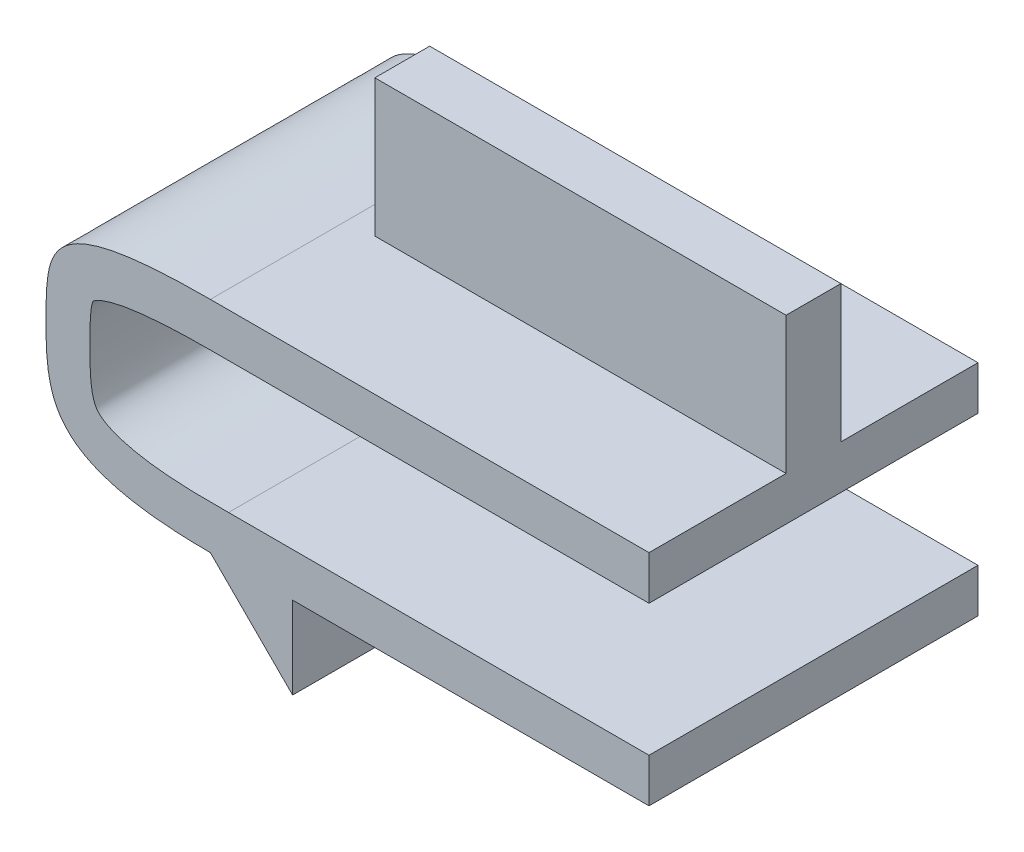
ISO-10303-21;
HEADER;
FILE_DESCRIPTION(('STEP AP214'),'2;1');
FILE_NAME('part.step','',(''),(''),'','','');
FILE_SCHEMA(('AUTOMOTIVE_DESIGN { 1 0 10303 214 1 1 1 1 }'));
ENDSEC;
DATA;
#1=APPLICATION_CONTEXT('core data for automotive mechanical design processes');
#2=APPLICATION_PROTOCOL_DEFINITION('international standard','automotive_design',2000,#1);
#3=PRODUCT_CONTEXT('',#1,'mechanical');
#4=PRODUCT('Part','Part','',(#3));
#5=PRODUCT_RELATED_PRODUCT_CATEGORY('part','',(#4));
#6=PRODUCT_DEFINITION_FORMATION('','',#4);
#7=PRODUCT_DEFINITION_CONTEXT('part definition',#1,'design');
#8=PRODUCT_DEFINITION('design','',#6,#7);
#9=PRODUCT_DEFINITION_SHAPE('','',#8);
#10=(LENGTH_UNIT() NAMED_UNIT(*) SI_UNIT(.MILLI.,.METRE.));
#11=(NAMED_UNIT(*) PLANE_ANGLE_UNIT() SI_UNIT($,.RADIAN.));
#12=(NAMED_UNIT(*) SI_UNIT($,.STERADIAN.) SOLID_ANGLE_UNIT());
#13=UNCERTAINTY_MEASURE_WITH_UNIT(LENGTH_MEASURE(1.E-05),#10,'distance_accuracy_value','');
#14=(GEOMETRIC_REPRESENTATION_CONTEXT(3) GLOBAL_UNCERTAINTY_ASSIGNED_CONTEXT((#13)) GLOBAL_UNIT_ASSIGNED_CONTEXT((#10,
#11,#12)) REPRESENTATION_CONTEXT('',''));
#15=CARTESIAN_POINT('',(0.,0.,0.));
#16=DIRECTION('',(0.,0.,1.));
#17=DIRECTION('',(1.,0.,0.));
#18=AXIS2_PLACEMENT_3D('',#15,#16,#17);
#19=CARTESIAN_POINT('',(22.,49.150430771125,49.2715397146817));
#20=DIRECTION('',(0.,1.,0.));
#21=DIRECTION('',(0.,0.,1.));
#22=AXIS2_PLACEMENT_3D('',#19,#20,#21);
#23=PLANE('',#22);
#24=DIRECTION('',(0.,0.,1.));
#25=VECTOR('',#24,1.);
#26=CARTESIAN_POINT('',(22.,49.150430771125,49.2715397146817));
#27=LINE('',#26,#25);
#28=CARTESIAN_POINT('',(22.,49.150430771125,56.2715397146817));
#29=VERTEX_POINT('',#28);
#30=CARTESIAN_POINT('',(22.,49.150430771125,61.2715397146816));
#31=VERTEX_POINT('',#30);
#32=EDGE_CURVE('E151',#29,#31,#27,.T.);
#33=ORIENTED_EDGE('',*,*,#32,.F.);
#34=DIRECTION('',(1.,0.,0.));
#35=VECTOR('',#34,1.);
#36=CARTESIAN_POINT('',(22.,49.150430771125,56.2715397146817));
#37=LINE('',#36,#35);
#38=CARTESIAN_POINT('',(7.,49.150430771125,56.2715397146817));
#39=VERTEX_POINT('',#38);
#40=EDGE_CURVE('E421',#39,#29,#37,.T.);
#41=ORIENTED_EDGE('',*,*,#40,.F.);
#42=DIRECTION('',(0.,0.,1.));
#43=VECTOR('',#42,1.);
#44=CARTESIAN_POINT('',(7.,49.150430771125,54.2715397146816));
#45=LINE('',#44,#43);
#46=CARTESIAN_POINT('',(7.,49.150430771125,54.2715397146816));
#47=VERTEX_POINT('',#46);
#48=EDGE_CURVE('E419',#47,#39,#45,.T.);
#49=ORIENTED_EDGE('',*,*,#48,.F.);
#50=DIRECTION('',(-1.,0.,0.));
#51=VECTOR('',#50,1.);
#52=CARTESIAN_POINT('',(22.,49.150430771125,54.2715397146816));
#53=LINE('',#52,#51);
#54=CARTESIAN_POINT('',(22.,49.150430771125,54.2715397146816));
#55=VERTEX_POINT('',#54);
#56=EDGE_CURVE('E414',#55,#47,#53,.T.);
#57=ORIENTED_EDGE('',*,*,#56,.F.);
#58=CARTESIAN_POINT('',(22.,49.150430771125,49.2715397146817));
#59=VERTEX_POINT('',#58);
#60=EDGE_CURVE('E37',#59,#55,#27,.T.);
#61=ORIENTED_EDGE('',*,*,#60,.F.);
#62=DIRECTION('',(-1.,0.,0.));
#63=VECTOR('',#62,1.);
#64=CARTESIAN_POINT('',(22.,49.150430771125,49.2715397146817));
#65=LINE('',#64,#63);
#66=CARTESIAN_POINT('',(6.,49.150430771125,49.2715397146817));
#67=VERTEX_POINT('',#66);
#68=EDGE_CURVE('E197',#59,#67,#65,.T.);
#69=ORIENTED_EDGE('',*,*,#68,.T.);
#70=DIRECTION('',(0.,0.,1.));
#71=VECTOR('',#70,1.);
#72=CARTESIAN_POINT('',(6.,49.150430771125,49.2715397146817));
#73=LINE('',#72,#71);
#74=CARTESIAN_POINT('',(6.,49.150430771125,61.2715397146816));
#75=VERTEX_POINT('',#74);
#76=EDGE_CURVE('E227',#67,#75,#73,.T.);
#77=ORIENTED_EDGE('',*,*,#76,.T.);
#78=DIRECTION('',(-1.,0.,0.));
#79=VECTOR('',#78,1.);
#80=CARTESIAN_POINT('',(22.,49.150430771125,61.2715397146816));
#81=LINE('',#80,#79);
#82=EDGE_CURVE('E241',#31,#75,#81,.T.);
#83=ORIENTED_EDGE('',*,*,#82,.F.);
#84=EDGE_LOOP('',(#33,#41,#49,#57,#61,#69,#77,#83));
#85=FACE_BOUND('',#84,.T.);
#86=ADVANCED_FACE('F33',(#85),#23,.T.);
#87=CARTESIAN_POINT('',(22.,49.150430771125,49.2715397146817));
#88=DIRECTION('',(1.,0.,0.));
#89=DIRECTION('',(0.,0.,-1.));
#90=AXIS2_PLACEMENT_3D('',#87,#88,#89);
#91=PLANE('',#90);
#92=DIRECTION('',(0.,1.,0.));
#93=VECTOR('',#92,1.);
#94=CARTESIAN_POINT('',(22.,49.150430771125,61.2715397146816));
#95=LINE('',#94,#93);
#96=CARTESIAN_POINT('',(22.,47.550430771125,61.2715397146816));
#97=VERTEX_POINT('',#96);
#98=EDGE_CURVE('E233',#97,#31,#95,.T.);
#99=ORIENTED_EDGE('',*,*,#98,.F.);
#100=DIRECTION('',(0.,0.,1.));
#101=VECTOR('',#100,1.);
#102=CARTESIAN_POINT('',(22.,47.550430771125,49.2715397146817));
#103=LINE('',#102,#101);
#104=CARTESIAN_POINT('',(22.,47.550430771125,49.2715397146817));
#105=VERTEX_POINT('',#104);
#106=EDGE_CURVE('E11',#105,#97,#103,.T.);
#107=ORIENTED_EDGE('',*,*,#106,.F.);
#108=DIRECTION('',(0.,1.,0.));
#109=VECTOR('',#108,1.);
#110=CARTESIAN_POINT('',(22.,49.150430771125,49.2715397146817));
#111=LINE('',#110,#109);
#112=EDGE_CURVE('E274',#105,#59,#111,.T.);
#113=ORIENTED_EDGE('',*,*,#112,.T.);
#114=ORIENTED_EDGE('',*,*,#60,.T.);
#115=DIRECTION('',(0.,-1.,0.));
#116=VECTOR('',#115,1.);
#117=CARTESIAN_POINT('',(22.,54.150430771125,54.2715397146816));
#118=LINE('',#117,#116);
#119=CARTESIAN_POINT('',(22.,54.150430771125,54.2715397146816));
#120=VERTEX_POINT('',#119);
#121=EDGE_CURVE('E50',#120,#55,#118,.T.);
#122=ORIENTED_EDGE('',*,*,#121,.F.);
#123=DIRECTION('',(0.,0.,-1.));
#124=VECTOR('',#123,1.);
#125=CARTESIAN_POINT('',(22.,54.150430771125,54.2715397146816));
#126=LINE('',#125,#124);
#127=CARTESIAN_POINT('',(22.,54.150430771125,56.2715397146817));
#128=VERTEX_POINT('',#127);
#129=EDGE_CURVE('E427',#128,#120,#126,.T.);
#130=ORIENTED_EDGE('',*,*,#129,.F.);
#131=DIRECTION('',(0.,-1.,0.));
#132=VECTOR('',#131,1.);
#133=CARTESIAN_POINT('',(22.,54.150430771125,56.2715397146817));
#134=LINE('',#133,#132);
#135=EDGE_CURVE('E238',#128,#29,#134,.T.);
#136=ORIENTED_EDGE('',*,*,#135,.T.);
#137=ORIENTED_EDGE('',*,*,#32,.T.);
#138=EDGE_LOOP('',(#99,#107,#113,#114,#122,#130,#136,#137));
#139=FACE_BOUND('',#138,.T.);
#140=ADVANCED_FACE('F35',(#139),#91,.T.);
#141=CARTESIAN_POINT('',(22.,47.550430771125,49.2715397146817));
#142=DIRECTION('',(0.,-1.,0.));
#143=DIRECTION('',(0.,0.,-1.));
#144=AXIS2_PLACEMENT_3D('',#141,#142,#143);
#145=PLANE('',#144);
#146=DIRECTION('',(1.,0.,0.));
#147=VECTOR('',#146,1.);
#148=CARTESIAN_POINT('',(22.,47.550430771125,61.2715397146816));
#149=LINE('',#148,#147);
#150=CARTESIAN_POINT('',(6.,47.550430771125,61.2715397146816));
#151=VERTEX_POINT('',#150);
#152=EDGE_CURVE('E247',#151,#97,#149,.T.);
#153=ORIENTED_EDGE('',*,*,#152,.F.);
#154=DIRECTION('',(0.,0.,1.));
#155=VECTOR('',#154,1.);
#156=CARTESIAN_POINT('',(6.,47.550430771125,49.2715397146817));
#157=LINE('',#156,#155);
#158=CARTESIAN_POINT('',(6.,47.550430771125,49.2715397146817));
#159=VERTEX_POINT('',#158);
#160=EDGE_CURVE('E42',#159,#151,#157,.T.);
#161=ORIENTED_EDGE('',*,*,#160,.F.);
#162=DIRECTION('',(1.,0.,0.));
#163=VECTOR('',#162,1.);
#164=CARTESIAN_POINT('',(22.,47.550430771125,49.2715397146817));
#165=LINE('',#164,#163);
#166=EDGE_CURVE('E149',#159,#105,#165,.T.);
#167=ORIENTED_EDGE('',*,*,#166,.T.);
#168=ORIENTED_EDGE('',*,*,#106,.T.);
#169=EDGE_LOOP('',(#153,#161,#167,#168));
#170=FACE_BOUND('',#169,.T.);
#171=ADVANCED_FACE('F165',(#170),#145,.T.);
#172=CARTESIAN_POINT('',(6.66274169979696,42.750430771125,49.2715397146817));
#173=CARTESIAN_POINT('',(6.47160088823269,42.750430771125,49.2715397146817));
#174=CARTESIAN_POINT('',(6.07904193757282,42.7498702434778,49.2715397146817));
#175=CARTESIAN_POINT('',(5.37614265650371,42.7532334093607,49.2715397146817));
#176=CARTESIAN_POINT('',(4.59988081173818,42.7880845511167,49.2715397146817));
#177=CARTESIAN_POINT('',(3.81969332066809,42.8668985136392,49.2715397146817));
#178=CARTESIAN_POINT('',(2.97653731280743,43.0136146335425,49.2715397146817));
#179=CARTESIAN_POINT('',(2.27916709540459,43.2525574910677,49.2715397146817));
#180=CARTESIAN_POINT('',(1.93401872146088,43.5047712976963,49.2715397146817));
#181=CARTESIAN_POINT('',(1.81326912175992,43.6675652404179,49.2715397146817));
#182=CARTESIAN_POINT('',(1.69428758935829,43.9668572934183,49.2715397146817));
#183=CARTESIAN_POINT('',(1.61923941258073,44.5278991404376,49.2715397146817));
#184=CARTESIAN_POINT('',(1.58831756064194,45.5733871927754,49.2715397146817));
#185=CARTESIAN_POINT('',(1.61671329296213,46.6651868076238,49.2715397146817));
#186=CARTESIAN_POINT('',(1.72665816453858,46.9657382190405,49.2715397146817));
#187=CARTESIAN_POINT('',(1.71037378285711,46.9384481127754,49.2715397146817));
#188=CARTESIAN_POINT('',(1.86636449004169,47.0834406198946,49.2715397146817));
#189=CARTESIAN_POINT('',(2.46718546350927,47.2861789246529,49.2715397146817));
#190=CARTESIAN_POINT('',(3.25217979280722,47.4161533034813,49.2715397146817));
#191=CARTESIAN_POINT('',(3.99560656570397,47.4917713720792,49.2715397146817));
#192=CARTESIAN_POINT('',(4.75173366158046,47.5314321917096,49.2715397146817));
#193=CARTESIAN_POINT('',(5.43260129723518,47.5476711522889,49.2715397146817));
#194=CARTESIAN_POINT('',(5.81430088516196,47.550430771125,49.2715397146817));
#195=CARTESIAN_POINT('',(6.,47.550430771125,49.2715397146817));
#196=B_SPLINE_CURVE_WITH_KNOTS('',3,(#172,#173,#174,#175,#176,#177,#178,#179,#180,#181,#182,
#183,#184,#185,#186,#187,#188,#189,#190,#191,#192,#193,#194,#195),.UNSPECIFIED.,.F.,.F.,(4,1,1,
1,1,1,1,1,1,1,1,1,1,1,1,1,1,1,1,1,1,4),(0.,0.0159123586008787,0.0318247172017572,
0.0636494344035142,0.0954741516052713,0.127298868807028,0.190948303210543,0.254597737614057,
0.318247172017571,0.381896606421085,0.4455460408246,0.509195475228114,0.636494344035142,
0.700143778438657,0.763793212842171,0.827442647245685,0.891092081649199,0.922916798850956,
0.954741516052714,0.986566233254471,1.00247859185535,1.01839095045623),.UNSPECIFIED.);
#197=DIRECTION('',(0.,0.,1.));
#198=VECTOR('',#197,1.);
#199=SURFACE_OF_LINEAR_EXTRUSION('',#196,#198);
#200=CARTESIAN_POINT('',(6.66274169979696,42.750430771125,61.2715397146816));
#201=CARTESIAN_POINT('',(6.47160088823269,42.750430771125,61.2715397146816));
#202=CARTESIAN_POINT('',(6.07904193757282,42.7498702434778,61.2715397146816));
#203=CARTESIAN_POINT('',(5.37614265650371,42.7532334093607,61.2715397146816));
#204=CARTESIAN_POINT('',(4.59988081173818,42.7880845511167,61.2715397146816));
#205=CARTESIAN_POINT('',(3.81969332066809,42.8668985136392,61.2715397146816));
#206=CARTESIAN_POINT('',(2.97653731280743,43.0136146335425,61.2715397146816));
#207=CARTESIAN_POINT('',(2.27916709540459,43.2525574910677,61.2715397146816));
#208=CARTESIAN_POINT('',(1.93401872146088,43.5047712976963,61.2715397146816));
#209=CARTESIAN_POINT('',(1.81326912175992,43.6675652404179,61.2715397146816));
#210=CARTESIAN_POINT('',(1.69428758935829,43.9668572934183,61.2715397146816));
#211=CARTESIAN_POINT('',(1.61923941258073,44.5278991404376,61.2715397146816));
#212=CARTESIAN_POINT('',(1.58831756064194,45.5733871927754,61.2715397146816));
#213=CARTESIAN_POINT('',(1.61671329296213,46.6651868076238,61.2715397146816));
#214=CARTESIAN_POINT('',(1.72665816453858,46.9657382190405,61.2715397146816));
#215=CARTESIAN_POINT('',(1.71037378285711,46.9384481127754,61.2715397146816));
#216=CARTESIAN_POINT('',(1.86636449004169,47.0834406198946,61.2715397146816));
#217=CARTESIAN_POINT('',(2.46718546350927,47.2861789246529,61.2715397146816));
#218=CARTESIAN_POINT('',(3.25217979280722,47.4161533034813,61.2715397146816));
#219=CARTESIAN_POINT('',(3.99560656570397,47.4917713720792,61.2715397146816));
#220=CARTESIAN_POINT('',(4.75173366158046,47.5314321917096,61.2715397146816));
#221=CARTESIAN_POINT('',(5.43260129723518,47.5476711522889,61.2715397146816));
#222=CARTESIAN_POINT('',(5.81430088516196,47.550430771125,61.2715397146816));
#223=CARTESIAN_POINT('',(6.,47.550430771125,61.2715397146816));
#224=B_SPLINE_CURVE_WITH_KNOTS('',3,(#200,#201,#202,#203,#204,#205,#206,#207,#208,#209,#210,
#211,#212,#213,#214,#215,#216,#217,#218,#219,#220,#221,#222,#223),.UNSPECIFIED.,.F.,.F.,(4,1,1,
1,1,1,1,1,1,1,1,1,1,1,1,1,1,1,1,1,1,4),(0.,0.0159123586008787,0.0318247172017572,
0.0636494344035142,0.0954741516052713,0.127298868807028,0.190948303210543,0.254597737614057,
0.318247172017571,0.381896606421085,0.4455460408246,0.509195475228114,0.636494344035142,
0.700143778438657,0.763793212842171,0.827442647245685,0.891092081649199,0.922916798850956,
0.954741516052714,0.986566233254471,1.00247859185535,1.01839095045623),.UNSPECIFIED.);
#225=CARTESIAN_POINT('',(6.66274169979696,42.750430771125,61.2715397146816));
#226=VERTEX_POINT('',#225);
#227=EDGE_CURVE('E145',#226,#151,#224,.T.);
#228=ORIENTED_EDGE('',*,*,#227,.F.);
#229=DIRECTION('',(0.,0.,1.));
#230=VECTOR('',#229,1.);
#231=CARTESIAN_POINT('',(6.66274169979696,42.750430771125,49.2715397146817));
#232=LINE('',#231,#230);
#233=CARTESIAN_POINT('',(6.66274169979696,42.750430771125,49.2715397146817));
#234=VERTEX_POINT('',#233);
#235=EDGE_CURVE('E129',#234,#226,#232,.T.);
#236=ORIENTED_EDGE('',*,*,#235,.F.);
#237=EDGE_CURVE('E137',#234,#159,#196,.T.);
#238=ORIENTED_EDGE('',*,*,#237,.T.);
#239=ORIENTED_EDGE('',*,*,#160,.T.);
#240=EDGE_LOOP('',(#228,#236,#238,#239));
#241=FACE_BOUND('',#240,.T.);
#242=ADVANCED_FACE('F142',(#241),#199,.T.);
#243=CARTESIAN_POINT('',(7.4,42.750430771125,49.2715397146817));
#244=DIRECTION('',(0.,1.,0.));
#245=DIRECTION('',(0.,0.,1.));
#246=AXIS2_PLACEMENT_3D('',#243,#244,#245);
#247=PLANE('',#246);
#248=DIRECTION('',(-1.,0.,0.));
#249=VECTOR('',#248,1.);
#250=CARTESIAN_POINT('',(7.4,42.750430771125,61.2715397146816));
#251=LINE('',#250,#249);
#252=CARTESIAN_POINT('',(22.,42.750430771125,61.2715397146816));
#253=VERTEX_POINT('',#252);
#254=EDGE_CURVE('E266',#253,#226,#251,.T.);
#255=ORIENTED_EDGE('',*,*,#254,.F.);
#256=DIRECTION('',(0.,0.,1.));
#257=VECTOR('',#256,1.);
#258=CARTESIAN_POINT('',(22.,42.750430771125,49.2715397146817));
#259=LINE('',#258,#257);
#260=CARTESIAN_POINT('',(22.,42.750430771125,49.2715397146817));
#261=VERTEX_POINT('',#260);
#262=EDGE_CURVE('E132',#261,#253,#259,.T.);
#263=ORIENTED_EDGE('',*,*,#262,.F.);
#264=DIRECTION('',(-1.,0.,0.));
#265=VECTOR('',#264,1.);
#266=CARTESIAN_POINT('',(7.4,42.750430771125,49.2715397146817));
#267=LINE('',#266,#265);
#268=EDGE_CURVE('E126',#261,#234,#267,.T.);
#269=ORIENTED_EDGE('',*,*,#268,.T.);
#270=ORIENTED_EDGE('',*,*,#235,.T.);
#271=EDGE_LOOP('',(#255,#263,#269,#270));
#272=FACE_BOUND('',#271,.T.);
#273=ADVANCED_FACE('F128',(#272),#247,.T.);
#274=CARTESIAN_POINT('',(22.,42.750430771125,49.2715397146817));
#275=DIRECTION('',(1.,0.,0.));
#276=DIRECTION('',(0.,0.,-1.));
#277=AXIS2_PLACEMENT_3D('',#274,#275,#276);
#278=PLANE('',#277);
#279=DIRECTION('',(0.,1.,0.));
#280=VECTOR('',#279,1.);
#281=CARTESIAN_POINT('',(22.,42.750430771125,61.2715397146816));
#282=LINE('',#281,#280);
#283=CARTESIAN_POINT('',(22.,41.150430771125,61.2715397146816));
#284=VERTEX_POINT('',#283);
#285=EDGE_CURVE('E264',#284,#253,#282,.T.);
#286=ORIENTED_EDGE('',*,*,#285,.F.);
#287=DIRECTION('',(0.,0.,1.));
#288=VECTOR('',#287,1.);
#289=CARTESIAN_POINT('',(22.,41.150430771125,49.2715397146817));
#290=LINE('',#289,#288);
#291=CARTESIAN_POINT('',(22.,41.150430771125,49.2715397146817));
#292=VERTEX_POINT('',#291);
#293=EDGE_CURVE('E211',#292,#284,#290,.T.);
#294=ORIENTED_EDGE('',*,*,#293,.F.);
#295=DIRECTION('',(0.,1.,0.));
#296=VECTOR('',#295,1.);
#297=CARTESIAN_POINT('',(22.,42.750430771125,49.2715397146817));
#298=LINE('',#297,#296);
#299=EDGE_CURVE('E138',#292,#261,#298,.T.);
#300=ORIENTED_EDGE('',*,*,#299,.T.);
#301=ORIENTED_EDGE('',*,*,#262,.T.);
#302=EDGE_LOOP('',(#286,#294,#300,#301));
#303=FACE_BOUND('',#302,.T.);
#304=ADVANCED_FACE('F169',(#303),#278,.T.);
#305=CARTESIAN_POINT('',(9.,41.150430771125,49.2715397146817));
#306=DIRECTION('',(0.,-1.,0.));
#307=DIRECTION('',(0.,0.,-1.));
#308=AXIS2_PLACEMENT_3D('',#305,#306,#307);
#309=PLANE('',#308);
#310=DIRECTION('',(1.,0.,0.));
#311=VECTOR('',#310,1.);
#312=CARTESIAN_POINT('',(9.,41.150430771125,61.2715397146816));
#313=LINE('',#312,#311);
#314=CARTESIAN_POINT('',(9.,41.150430771125,61.2715397146816));
#315=VERTEX_POINT('',#314);
#316=EDGE_CURVE('E217',#315,#284,#313,.T.);
#317=ORIENTED_EDGE('',*,*,#316,.F.);
#318=DIRECTION('',(0.,0.,1.));
#319=VECTOR('',#318,1.);
#320=CARTESIAN_POINT('',(9.,41.150430771125,49.2715397146817));
#321=LINE('',#320,#319);
#322=CARTESIAN_POINT('',(9.,41.150430771125,49.2715397146817));
#323=VERTEX_POINT('',#322);
#324=EDGE_CURVE('E215',#323,#315,#321,.T.);
#325=ORIENTED_EDGE('',*,*,#324,.F.);
#326=DIRECTION('',(1.,0.,0.));
#327=VECTOR('',#326,1.);
#328=CARTESIAN_POINT('',(9.,41.150430771125,49.2715397146817));
#329=LINE('',#328,#327);
#330=EDGE_CURVE('E207',#323,#292,#329,.T.);
#331=ORIENTED_EDGE('',*,*,#330,.T.);
#332=ORIENTED_EDGE('',*,*,#293,.T.);
#333=EDGE_LOOP('',(#317,#325,#331,#332));
#334=FACE_BOUND('',#333,.T.);
#335=ADVANCED_FACE('F172',(#334),#309,.T.);
#336=CARTESIAN_POINT('',(9.,38.150430771125,49.2715397146817));
#337=DIRECTION('',(1.,0.,0.));
#338=DIRECTION('',(0.,0.,-1.));
#339=AXIS2_PLACEMENT_3D('',#336,#337,#338);
#340=PLANE('',#339);
#341=DIRECTION('',(0.,1.,0.));
#342=VECTOR('',#341,1.);
#343=CARTESIAN_POINT('',(9.,38.150430771125,61.2715397146816));
#344=LINE('',#343,#342);
#345=CARTESIAN_POINT('',(9.,38.150430771125,61.2715397146816));
#346=VERTEX_POINT('',#345);
#347=EDGE_CURVE('E261',#346,#315,#344,.T.);
#348=ORIENTED_EDGE('',*,*,#347,.F.);
#349=DIRECTION('',(0.,0.,1.));
#350=VECTOR('',#349,1.);
#351=CARTESIAN_POINT('',(9.,38.150430771125,49.2715397146817));
#352=LINE('',#351,#350);
#353=CARTESIAN_POINT('',(9.,38.150430771125,49.2715397146817));
#354=VERTEX_POINT('',#353);
#355=EDGE_CURVE('E220',#354,#346,#352,.T.);
#356=ORIENTED_EDGE('',*,*,#355,.F.);
#357=DIRECTION('',(0.,1.,0.));
#358=VECTOR('',#357,1.);
#359=CARTESIAN_POINT('',(9.,38.150430771125,49.2715397146817));
#360=LINE('',#359,#358);
#361=EDGE_CURVE('E204',#354,#323,#360,.T.);
#362=ORIENTED_EDGE('',*,*,#361,.T.);
#363=ORIENTED_EDGE('',*,*,#324,.T.);
#364=EDGE_LOOP('',(#348,#356,#362,#363));
#365=FACE_BOUND('',#364,.T.);
#366=ADVANCED_FACE('F176',(#365),#340,.T.);
#367=CARTESIAN_POINT('',(6.,41.150430771125,49.2715397146817));
#368=DIRECTION('',(-0.707106781186548,-0.707106781186547,0.));
#369=DIRECTION('',(0.707106781186547,-0.707106781186548,0.));
#370=AXIS2_PLACEMENT_3D('',#367,#368,#369);
#371=PLANE('',#370);
#372=DIRECTION('',(0.707106781186547,-0.707106781186548,0.));
#373=VECTOR('',#372,1.);
#374=CARTESIAN_POINT('',(6.,41.150430771125,61.2715397146816));
#375=LINE('',#374,#373);
#376=CARTESIAN_POINT('',(6.00000000000001,41.150430771125,61.2715397146816));
#377=VERTEX_POINT('',#376);
#378=EDGE_CURVE('E255',#377,#346,#375,.T.);
#379=ORIENTED_EDGE('',*,*,#378,.F.);
#380=DIRECTION('',(0.,0.,1.));
#381=VECTOR('',#380,1.);
#382=CARTESIAN_POINT('',(6.00000000000001,41.150430771125,49.2715397146817));
#383=LINE('',#382,#381);
#384=CARTESIAN_POINT('',(6.00000000000001,41.150430771125,49.2715397146817));
#385=VERTEX_POINT('',#384);
#386=EDGE_CURVE('E223',#385,#377,#383,.T.);
#387=ORIENTED_EDGE('',*,*,#386,.F.);
#388=DIRECTION('',(0.707106781186547,-0.707106781186548,0.));
#389=VECTOR('',#388,1.);
#390=CARTESIAN_POINT('',(6.,41.150430771125,49.2715397146817));
#391=LINE('',#390,#389);
#392=EDGE_CURVE('E196',#385,#354,#391,.T.);
#393=ORIENTED_EDGE('',*,*,#392,.T.);
#394=ORIENTED_EDGE('',*,*,#355,.T.);
#395=EDGE_LOOP('',(#379,#387,#393,#394));
#396=FACE_BOUND('',#395,.T.);
#397=ADVANCED_FACE('F180',(#396),#371,.T.);
#398=CARTESIAN_POINT('',(6.,49.150430771125,49.2715397146817));
#399=CARTESIAN_POINT('',(0.397936137188442,49.150430771125,49.2715397146817));
#400=CARTESIAN_POINT('',(0.000649692146265821,47.779287292606,49.2715397146817));
#401=CARTESIAN_POINT('',(-0.00845399970684804,43.1664392270151,49.2715397146817));
#402=CARTESIAN_POINT('',(0.529679054144731,41.150430771125,49.2715397146817));
#403=CARTESIAN_POINT('',(6.00000000000001,41.150430771125,49.2715397146817));
#404=B_SPLINE_CURVE_WITH_KNOTS('',3,(#398,#399,#400,#401,#402,#403),.UNSPECIFIED.,.F.,.F.,(4,1,
1,4),(0.,0.444599042768643,0.544599042768643,1.),.UNSPECIFIED.);
#405=DIRECTION('',(0.,0.,1.));
#406=VECTOR('',#405,1.);
#407=SURFACE_OF_LINEAR_EXTRUSION('',#404,#406);
#408=CARTESIAN_POINT('',(6.,49.150430771125,61.2715397146816));
#409=CARTESIAN_POINT('',(0.397936137188442,49.150430771125,61.2715397146816));
#410=CARTESIAN_POINT('',(0.000649692146265821,47.779287292606,61.2715397146816));
#411=CARTESIAN_POINT('',(-0.00845399970684804,43.1664392270151,61.2715397146816));
#412=CARTESIAN_POINT('',(0.529679054144731,41.150430771125,61.2715397146816));
#413=CARTESIAN_POINT('',(6.00000000000001,41.150430771125,61.2715397146816));
#414=B_SPLINE_CURVE_WITH_KNOTS('',3,(#408,#409,#410,#411,#412,#413),.UNSPECIFIED.,.F.,.F.,(4,1,
1,4),(0.,0.444599042768643,0.544599042768643,1.),.UNSPECIFIED.);
#415=EDGE_CURVE('E244',#75,#377,#414,.T.);
#416=ORIENTED_EDGE('',*,*,#415,.F.);
#417=ORIENTED_EDGE('',*,*,#76,.F.);
#418=EDGE_CURVE('E189',#67,#385,#404,.T.);
#419=ORIENTED_EDGE('',*,*,#418,.T.);
#420=ORIENTED_EDGE('',*,*,#386,.T.);
#421=EDGE_LOOP('',(#416,#417,#419,#420));
#422=FACE_BOUND('',#421,.T.);
#423=ADVANCED_FACE('F184',(#422),#407,.T.);
#424=CARTESIAN_POINT('',(1.60099115564822,45.3158744765668,49.2715397146817));
#425=DIRECTION('',(0.,0.,-1.));
#426=DIRECTION('',(-1.,0.,0.));
#427=AXIS2_PLACEMENT_3D('',#424,#425,#426);
#428=PLANE('',#427);
#429=ORIENTED_EDGE('',*,*,#112,.F.);
#430=ORIENTED_EDGE('',*,*,#166,.F.);
#431=ORIENTED_EDGE('',*,*,#237,.F.);
#432=ORIENTED_EDGE('',*,*,#268,.F.);
#433=ORIENTED_EDGE('',*,*,#299,.F.);
#434=ORIENTED_EDGE('',*,*,#330,.F.);
#435=ORIENTED_EDGE('',*,*,#361,.F.);
#436=ORIENTED_EDGE('',*,*,#392,.F.);
#437=ORIENTED_EDGE('',*,*,#418,.F.);
#438=ORIENTED_EDGE('',*,*,#68,.F.);
#439=EDGE_LOOP('',(#429,#430,#431,#432,#433,#434,#435,#436,#437,#438));
#440=FACE_BOUND('',#439,.T.);
#441=ADVANCED_FACE('F148',(#440),#428,.T.);
#442=CARTESIAN_POINT('',(1.60099115564822,45.3158744765668,61.2715397146816));
#443=DIRECTION('',(0.,0.,-1.));
#444=DIRECTION('',(-1.,0.,0.));
#445=AXIS2_PLACEMENT_3D('',#442,#443,#444);
#446=PLANE('',#445);
#447=ORIENTED_EDGE('',*,*,#98,.T.);
#448=ORIENTED_EDGE('',*,*,#82,.T.);
#449=ORIENTED_EDGE('',*,*,#415,.T.);
#450=ORIENTED_EDGE('',*,*,#378,.T.);
#451=ORIENTED_EDGE('',*,*,#347,.T.);
#452=ORIENTED_EDGE('',*,*,#316,.T.);
#453=ORIENTED_EDGE('',*,*,#285,.T.);
#454=ORIENTED_EDGE('',*,*,#254,.T.);
#455=ORIENTED_EDGE('',*,*,#227,.T.);
#456=ORIENTED_EDGE('',*,*,#152,.T.);
#457=EDGE_LOOP('',(#447,#448,#449,#450,#451,#452,#453,#454,#455,#456));
#458=FACE_BOUND('',#457,.T.);
#459=ADVANCED_FACE('F246',(#458),#446,.F.);
#460=CARTESIAN_POINT('',(7.,54.150430771125,54.2715397146816));
#461=DIRECTION('',(1.,0.,0.));
#462=DIRECTION('',(0.,0.,-1.));
#463=AXIS2_PLACEMENT_3D('',#460,#461,#462);
#464=PLANE('',#463);
#465=ORIENTED_EDGE('',*,*,#48,.T.);
#466=DIRECTION('',(0.,-1.,0.));
#467=VECTOR('',#466,1.);
#468=CARTESIAN_POINT('',(7.,54.150430771125,56.2715397146817));
#469=LINE('',#468,#467);
#470=CARTESIAN_POINT('',(7.,54.150430771125,56.2715397146817));
#471=VERTEX_POINT('',#470);
#472=EDGE_CURVE('E248',#471,#39,#469,.T.);
#473=ORIENTED_EDGE('',*,*,#472,.F.);
#474=DIRECTION('',(0.,0.,1.));
#475=VECTOR('',#474,1.);
#476=CARTESIAN_POINT('',(7.,54.150430771125,54.2715397146816));
#477=LINE('',#476,#475);
#478=CARTESIAN_POINT('',(7.,54.150430771125,54.2715397146816));
#479=VERTEX_POINT('',#478);
#480=EDGE_CURVE('E404',#479,#471,#477,.T.);
#481=ORIENTED_EDGE('',*,*,#480,.F.);
#482=DIRECTION('',(0.,-1.,0.));
#483=VECTOR('',#482,1.);
#484=CARTESIAN_POINT('',(7.,54.150430771125,54.2715397146816));
#485=LINE('',#484,#483);
#486=EDGE_CURVE('E429',#479,#47,#485,.T.);
#487=ORIENTED_EDGE('',*,*,#486,.T.);
#488=EDGE_LOOP('',(#465,#473,#481,#487));
#489=FACE_BOUND('',#488,.T.);
#490=ADVANCED_FACE('F295',(#489),#464,.F.);
#491=CARTESIAN_POINT('',(22.,54.150430771125,56.2715397146817));
#492=DIRECTION('',(0.,0.,-1.));
#493=DIRECTION('',(-1.,0.,0.));
#494=AXIS2_PLACEMENT_3D('',#491,#492,#493);
#495=PLANE('',#494);
#496=ORIENTED_EDGE('',*,*,#40,.T.);
#497=ORIENTED_EDGE('',*,*,#135,.F.);
#498=DIRECTION('',(1.,0.,0.));
#499=VECTOR('',#498,1.);
#500=CARTESIAN_POINT('',(22.,54.150430771125,56.2715397146817));
#501=LINE('',#500,#499);
#502=EDGE_CURVE('E409',#471,#128,#501,.T.);
#503=ORIENTED_EDGE('',*,*,#502,.F.);
#504=ORIENTED_EDGE('',*,*,#472,.T.);
#505=EDGE_LOOP('',(#496,#497,#503,#504));
#506=FACE_BOUND('',#505,.T.);
#507=ADVANCED_FACE('F299',(#506),#495,.F.);
#508=CARTESIAN_POINT('',(22.,54.150430771125,54.2715397146816));
#509=DIRECTION('',(0.,0.,1.));
#510=DIRECTION('',(1.,0.,0.));
#511=AXIS2_PLACEMENT_3D('',#508,#509,#510);
#512=PLANE('',#511);
#513=ORIENTED_EDGE('',*,*,#56,.T.);
#514=ORIENTED_EDGE('',*,*,#486,.F.);
#515=DIRECTION('',(-1.,0.,0.));
#516=VECTOR('',#515,1.);
#517=CARTESIAN_POINT('',(22.,54.150430771125,54.2715397146816));
#518=LINE('',#517,#516);
#519=EDGE_CURVE('E410',#120,#479,#518,.T.);
#520=ORIENTED_EDGE('',*,*,#519,.F.);
#521=ORIENTED_EDGE('',*,*,#121,.T.);
#522=EDGE_LOOP('',(#513,#514,#520,#521));
#523=FACE_BOUND('',#522,.T.);
#524=ADVANCED_FACE('F310',(#523),#512,.F.);
#525=CARTESIAN_POINT('',(0.,54.150430771125,0.));
#526=DIRECTION('',(0.,-1.,0.));
#527=DIRECTION('',(0.,0.,-1.));
#528=AXIS2_PLACEMENT_3D('',#525,#526,#527);
#529=PLANE('',#528);
#530=ORIENTED_EDGE('',*,*,#480,.T.);
#531=ORIENTED_EDGE('',*,*,#502,.T.);
#532=ORIENTED_EDGE('',*,*,#129,.T.);
#533=ORIENTED_EDGE('',*,*,#519,.T.);
#534=EDGE_LOOP('',(#530,#531,#532,#533));
#535=FACE_BOUND('',#534,.T.);
#536=ADVANCED_FACE('F320',(#535),#529,.F.);
#537=CLOSED_SHELL('',(#86,#140,#171,#242,#273,#304,#335,#366,#397,#423,#441,#459,#490,#507,#524,#536));
#538=MANIFOLD_SOLID_BREP('B2',#537);
#539=ADVANCED_BREP_SHAPE_REPRESENTATION('',(#18,#538),#14);
#540=SHAPE_DEFINITION_REPRESENTATION(#9,#539);
ENDSEC;
END-ISO-10303-21;
